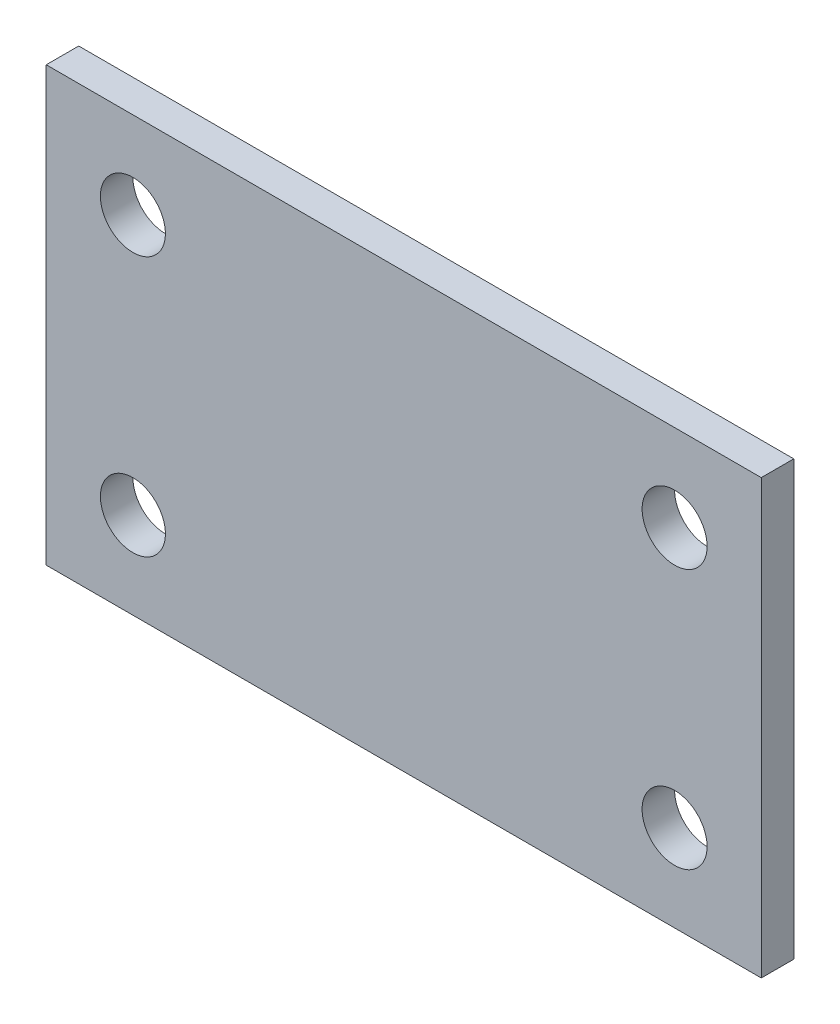
ISO-10303-21;
HEADER;
FILE_DESCRIPTION(('STEP AP214'),'2;1');
FILE_NAME('part.step','',(''),(''),'','','');
FILE_SCHEMA(('AUTOMOTIVE_DESIGN { 1 0 10303 214 1 1 1 1 }'));
ENDSEC;
DATA;
#1=APPLICATION_CONTEXT('core data for automotive mechanical design processes');
#2=APPLICATION_PROTOCOL_DEFINITION('international standard','automotive_design',2000,#1);
#3=PRODUCT_CONTEXT('',#1,'mechanical');
#4=PRODUCT('Part','Part','',(#3));
#5=PRODUCT_RELATED_PRODUCT_CATEGORY('part','',(#4));
#6=PRODUCT_DEFINITION_FORMATION('','',#4);
#7=PRODUCT_DEFINITION_CONTEXT('part definition',#1,'design');
#8=PRODUCT_DEFINITION('design','',#6,#7);
#9=PRODUCT_DEFINITION_SHAPE('','',#8);
#10=(LENGTH_UNIT() NAMED_UNIT(*) SI_UNIT(.MILLI.,.METRE.));
#11=(NAMED_UNIT(*) PLANE_ANGLE_UNIT() SI_UNIT($,.RADIAN.));
#12=(NAMED_UNIT(*) SI_UNIT($,.STERADIAN.) SOLID_ANGLE_UNIT());
#13=UNCERTAINTY_MEASURE_WITH_UNIT(LENGTH_MEASURE(1.E-05),#10,'distance_accuracy_value','');
#14=(GEOMETRIC_REPRESENTATION_CONTEXT(3) GLOBAL_UNCERTAINTY_ASSIGNED_CONTEXT((#13)) GLOBAL_UNIT_ASSIGNED_CONTEXT((#10,
#11,#12)) REPRESENTATION_CONTEXT('',''));
#15=CARTESIAN_POINT('',(0.,0.,0.));
#16=DIRECTION('',(0.,0.,1.));
#17=DIRECTION('',(1.,0.,0.));
#18=AXIS2_PLACEMENT_3D('',#15,#16,#17);
#19=CARTESIAN_POINT('',(0.,0.,3.));
#20=DIRECTION('',(0.,0.,1.));
#21=DIRECTION('',(1.,0.,0.));
#22=AXIS2_PLACEMENT_3D('',#19,#20,#21);
#23=PLANE('',#22);
#24=CARTESIAN_POINT('',(-25.,-12.,3.));
#25=DIRECTION('',(0.,0.,1.));
#26=DIRECTION('',(-1.,0.,0.));
#27=AXIS2_PLACEMENT_3D('',#24,#25,#26);
#28=CIRCLE('',#27,3.);
#29=CARTESIAN_POINT('',(-28.,-12.,3.));
#30=VERTEX_POINT('',#29);
#31=EDGE_CURVE('E123',#30,#30,#28,.T.);
#32=ORIENTED_EDGE('',*,*,#31,.F.);
#33=EDGE_LOOP('',(#32));
#34=FACE_BOUND('',#33,.T.);
#35=CARTESIAN_POINT('',(25.,12.,3.));
#36=DIRECTION('',(0.,0.,1.));
#37=DIRECTION('',(1.,0.,0.));
#38=AXIS2_PLACEMENT_3D('',#35,#36,#37);
#39=CIRCLE('',#38,3.);
#40=CARTESIAN_POINT('',(28.,12.,3.));
#41=VERTEX_POINT('',#40);
#42=EDGE_CURVE('E102',#41,#41,#39,.T.);
#43=ORIENTED_EDGE('',*,*,#42,.F.);
#44=EDGE_LOOP('',(#43));
#45=FACE_BOUND('',#44,.T.);
#46=DIRECTION('',(0.,-1.,0.));
#47=VECTOR('',#46,1.);
#48=CARTESIAN_POINT('',(-33.,20.,3.));
#49=LINE('',#48,#47);
#50=CARTESIAN_POINT('',(-33.,20.,3.));
#51=VERTEX_POINT('',#50);
#52=CARTESIAN_POINT('',(-33.,-20.,3.));
#53=VERTEX_POINT('',#52);
#54=EDGE_CURVE('E87',#51,#53,#49,.T.);
#55=ORIENTED_EDGE('',*,*,#54,.T.);
#56=DIRECTION('',(1.,0.,0.));
#57=VECTOR('',#56,1.);
#58=CARTESIAN_POINT('',(-33.,-20.,3.));
#59=LINE('',#58,#57);
#60=CARTESIAN_POINT('',(33.,-20.,3.));
#61=VERTEX_POINT('',#60);
#62=EDGE_CURVE('E82',#53,#61,#59,.T.);
#63=ORIENTED_EDGE('',*,*,#62,.T.);
#64=DIRECTION('',(0.,1.,0.));
#65=VECTOR('',#64,1.);
#66=CARTESIAN_POINT('',(33.,20.,3.));
#67=LINE('',#66,#65);
#68=CARTESIAN_POINT('',(33.,20.,3.));
#69=VERTEX_POINT('',#68);
#70=EDGE_CURVE('E85',#61,#69,#67,.T.);
#71=ORIENTED_EDGE('',*,*,#70,.T.);
#72=DIRECTION('',(-1.,0.,0.));
#73=VECTOR('',#72,1.);
#74=CARTESIAN_POINT('',(-33.,20.,3.));
#75=LINE('',#74,#73);
#76=EDGE_CURVE('E52',#69,#51,#75,.T.);
#77=ORIENTED_EDGE('',*,*,#76,.T.);
#78=EDGE_LOOP('',(#55,#63,#71,#77));
#79=FACE_BOUND('',#78,.T.);
#80=CARTESIAN_POINT('',(25.,-12.,3.));
#81=DIRECTION('',(0.,0.,1.));
#82=DIRECTION('',(1.,0.,0.));
#83=AXIS2_PLACEMENT_3D('',#80,#81,#82);
#84=CIRCLE('',#83,3.);
#85=CARTESIAN_POINT('',(28.,-12.,3.));
#86=VERTEX_POINT('',#85);
#87=EDGE_CURVE('E117',#86,#86,#84,.T.);
#88=ORIENTED_EDGE('',*,*,#87,.F.);
#89=EDGE_LOOP('',(#88));
#90=FACE_BOUND('',#89,.T.);
#91=CARTESIAN_POINT('',(-25.,12.,3.));
#92=DIRECTION('',(0.,0.,1.));
#93=DIRECTION('',(-1.,0.,0.));
#94=AXIS2_PLACEMENT_3D('',#91,#92,#93);
#95=CIRCLE('',#94,3.);
#96=CARTESIAN_POINT('',(-28.,12.,3.));
#97=VERTEX_POINT('',#96);
#98=EDGE_CURVE('E129',#97,#97,#95,.T.);
#99=ORIENTED_EDGE('',*,*,#98,.F.);
#100=EDGE_LOOP('',(#99));
#101=FACE_BOUND('',#100,.T.);
#102=ADVANCED_FACE('F35',(#34,#45,#79,#90,#101),#23,.T.);
#103=CARTESIAN_POINT('',(0.,0.,0.));
#104=DIRECTION('',(0.,0.,1.));
#105=DIRECTION('',(1.,0.,0.));
#106=AXIS2_PLACEMENT_3D('',#103,#104,#105);
#107=PLANE('',#106);
#108=DIRECTION('',(0.,-1.,0.));
#109=VECTOR('',#108,1.);
#110=CARTESIAN_POINT('',(-33.,20.,0.));
#111=LINE('',#110,#109);
#112=CARTESIAN_POINT('',(-33.,20.,0.));
#113=VERTEX_POINT('',#112);
#114=CARTESIAN_POINT('',(-33.,-20.,0.));
#115=VERTEX_POINT('',#114);
#116=EDGE_CURVE('E99',#113,#115,#111,.T.);
#117=ORIENTED_EDGE('',*,*,#116,.F.);
#118=DIRECTION('',(-1.,0.,0.));
#119=VECTOR('',#118,1.);
#120=CARTESIAN_POINT('',(-33.,20.,0.));
#121=LINE('',#120,#119);
#122=CARTESIAN_POINT('',(33.,20.,0.));
#123=VERTEX_POINT('',#122);
#124=EDGE_CURVE('E75',#123,#113,#121,.T.);
#125=ORIENTED_EDGE('',*,*,#124,.F.);
#126=DIRECTION('',(0.,1.,0.));
#127=VECTOR('',#126,1.);
#128=CARTESIAN_POINT('',(33.,20.,0.));
#129=LINE('',#128,#127);
#130=CARTESIAN_POINT('',(33.,-20.,0.));
#131=VERTEX_POINT('',#130);
#132=EDGE_CURVE('E69',#131,#123,#129,.T.);
#133=ORIENTED_EDGE('',*,*,#132,.F.);
#134=DIRECTION('',(1.,0.,0.));
#135=VECTOR('',#134,1.);
#136=CARTESIAN_POINT('',(-33.,-20.,0.));
#137=LINE('',#136,#135);
#138=EDGE_CURVE('E91',#115,#131,#137,.T.);
#139=ORIENTED_EDGE('',*,*,#138,.F.);
#140=EDGE_LOOP('',(#117,#125,#133,#139));
#141=FACE_BOUND('',#140,.T.);
#142=CARTESIAN_POINT('',(25.,12.,0.));
#143=DIRECTION('',(0.,0.,1.));
#144=DIRECTION('',(1.,0.,0.));
#145=AXIS2_PLACEMENT_3D('',#142,#143,#144);
#146=CIRCLE('',#145,3.);
#147=CARTESIAN_POINT('',(28.,12.,0.));
#148=VERTEX_POINT('',#147);
#149=EDGE_CURVE('E114',#148,#148,#146,.T.);
#150=ORIENTED_EDGE('',*,*,#149,.T.);
#151=EDGE_LOOP('',(#150));
#152=FACE_BOUND('',#151,.T.);
#153=CARTESIAN_POINT('',(25.,-12.,0.));
#154=DIRECTION('',(0.,0.,1.));
#155=DIRECTION('',(1.,0.,0.));
#156=AXIS2_PLACEMENT_3D('',#153,#154,#155);
#157=CIRCLE('',#156,3.);
#158=CARTESIAN_POINT('',(28.,-12.,0.));
#159=VERTEX_POINT('',#158);
#160=EDGE_CURVE('E120',#159,#159,#157,.T.);
#161=ORIENTED_EDGE('',*,*,#160,.T.);
#162=EDGE_LOOP('',(#161));
#163=FACE_BOUND('',#162,.T.);
#164=CARTESIAN_POINT('',(-25.,-12.,0.));
#165=DIRECTION('',(0.,0.,1.));
#166=DIRECTION('',(-1.,0.,0.));
#167=AXIS2_PLACEMENT_3D('',#164,#165,#166);
#168=CIRCLE('',#167,3.);
#169=CARTESIAN_POINT('',(-28.,-12.,0.));
#170=VERTEX_POINT('',#169);
#171=EDGE_CURVE('E126',#170,#170,#168,.T.);
#172=ORIENTED_EDGE('',*,*,#171,.T.);
#173=EDGE_LOOP('',(#172));
#174=FACE_BOUND('',#173,.T.);
#175=CARTESIAN_POINT('',(-25.,12.,0.));
#176=DIRECTION('',(0.,0.,1.));
#177=DIRECTION('',(-1.,0.,0.));
#178=AXIS2_PLACEMENT_3D('',#175,#176,#177);
#179=CIRCLE('',#178,3.);
#180=CARTESIAN_POINT('',(-28.,12.,0.));
#181=VERTEX_POINT('',#180);
#182=EDGE_CURVE('E132',#181,#181,#179,.T.);
#183=ORIENTED_EDGE('',*,*,#182,.T.);
#184=EDGE_LOOP('',(#183));
#185=FACE_BOUND('',#184,.T.);
#186=ADVANCED_FACE('F110',(#141,#152,#163,#174,#185),#107,.F.);
#187=CARTESIAN_POINT('',(-33.,20.,3.));
#188=DIRECTION('',(1.,0.,0.));
#189=DIRECTION('',(0.,1.,0.));
#190=AXIS2_PLACEMENT_3D('',#187,#188,#189);
#191=PLANE('',#190);
#192=ORIENTED_EDGE('',*,*,#116,.T.);
#193=DIRECTION('',(0.,0.,-1.));
#194=VECTOR('',#193,1.);
#195=CARTESIAN_POINT('',(-33.,-20.,3.));
#196=LINE('',#195,#194);
#197=EDGE_CURVE('E11',#53,#115,#196,.T.);
#198=ORIENTED_EDGE('',*,*,#197,.F.);
#199=ORIENTED_EDGE('',*,*,#54,.F.);
#200=DIRECTION('',(0.,0.,-1.));
#201=VECTOR('',#200,1.);
#202=CARTESIAN_POINT('',(-33.,20.,3.));
#203=LINE('',#202,#201);
#204=EDGE_CURVE('E95',#51,#113,#203,.T.);
#205=ORIENTED_EDGE('',*,*,#204,.T.);
#206=EDGE_LOOP('',(#192,#198,#199,#205));
#207=FACE_BOUND('',#206,.T.);
#208=ADVANCED_FACE('F37',(#207),#191,.F.);
#209=CARTESIAN_POINT('',(-33.,-20.,3.));
#210=DIRECTION('',(0.,1.,0.));
#211=DIRECTION('',(0.,0.,1.));
#212=AXIS2_PLACEMENT_3D('',#209,#210,#211);
#213=PLANE('',#212);
#214=ORIENTED_EDGE('',*,*,#138,.T.);
#215=DIRECTION('',(0.,0.,-1.));
#216=VECTOR('',#215,1.);
#217=CARTESIAN_POINT('',(33.,-20.,3.));
#218=LINE('',#217,#216);
#219=EDGE_CURVE('E44',#61,#131,#218,.T.);
#220=ORIENTED_EDGE('',*,*,#219,.F.);
#221=ORIENTED_EDGE('',*,*,#62,.F.);
#222=ORIENTED_EDGE('',*,*,#197,.T.);
#223=EDGE_LOOP('',(#214,#220,#221,#222));
#224=FACE_BOUND('',#223,.T.);
#225=ADVANCED_FACE('F90',(#224),#213,.F.);
#226=CARTESIAN_POINT('',(33.,20.,3.));
#227=DIRECTION('',(-1.,0.,0.));
#228=DIRECTION('',(0.,-1.,0.));
#229=AXIS2_PLACEMENT_3D('',#226,#227,#228);
#230=PLANE('',#229);
#231=ORIENTED_EDGE('',*,*,#132,.T.);
#232=DIRECTION('',(0.,0.,-1.));
#233=VECTOR('',#232,1.);
#234=CARTESIAN_POINT('',(33.,20.,3.));
#235=LINE('',#234,#233);
#236=EDGE_CURVE('E92',#69,#123,#235,.T.);
#237=ORIENTED_EDGE('',*,*,#236,.F.);
#238=ORIENTED_EDGE('',*,*,#70,.F.);
#239=ORIENTED_EDGE('',*,*,#219,.T.);
#240=EDGE_LOOP('',(#231,#237,#238,#239));
#241=FACE_BOUND('',#240,.T.);
#242=ADVANCED_FACE('F93',(#241),#230,.F.);
#243=CARTESIAN_POINT('',(-33.,20.,3.));
#244=DIRECTION('',(0.,-1.,0.));
#245=DIRECTION('',(0.,0.,-1.));
#246=AXIS2_PLACEMENT_3D('',#243,#244,#245);
#247=PLANE('',#246);
#248=ORIENTED_EDGE('',*,*,#124,.T.);
#249=ORIENTED_EDGE('',*,*,#204,.F.);
#250=ORIENTED_EDGE('',*,*,#76,.F.);
#251=ORIENTED_EDGE('',*,*,#236,.T.);
#252=EDGE_LOOP('',(#248,#249,#250,#251));
#253=FACE_BOUND('',#252,.T.);
#254=ADVANCED_FACE('F107',(#253),#247,.F.);
#255=CARTESIAN_POINT('',(25.,12.,3.));
#256=DIRECTION('',(0.,0.,-1.));
#257=DIRECTION('',(-1.,0.,0.));
#258=AXIS2_PLACEMENT_3D('',#255,#256,#257);
#259=CYLINDRICAL_SURFACE('',#258,3.);
#260=ORIENTED_EDGE('',*,*,#42,.T.);
#261=EDGE_LOOP('',(#260));
#262=FACE_BOUND('',#261,.T.);
#263=ORIENTED_EDGE('',*,*,#149,.F.);
#264=EDGE_LOOP('',(#263));
#265=FACE_BOUND('',#264,.T.);
#266=ADVANCED_FACE('F151',(#262,#265),#259,.F.);
#267=CARTESIAN_POINT('',(25.,-12.,3.));
#268=DIRECTION('',(0.,0.,-1.));
#269=DIRECTION('',(-1.,0.,0.));
#270=AXIS2_PLACEMENT_3D('',#267,#268,#269);
#271=CYLINDRICAL_SURFACE('',#270,3.);
#272=ORIENTED_EDGE('',*,*,#87,.T.);
#273=EDGE_LOOP('',(#272));
#274=FACE_BOUND('',#273,.T.);
#275=ORIENTED_EDGE('',*,*,#160,.F.);
#276=EDGE_LOOP('',(#275));
#277=FACE_BOUND('',#276,.T.);
#278=ADVANCED_FACE('F197',(#274,#277),#271,.F.);
#279=CARTESIAN_POINT('',(-25.,-12.,3.));
#280=DIRECTION('',(0.,0.,-1.));
#281=DIRECTION('',(-1.,0.,0.));
#282=AXIS2_PLACEMENT_3D('',#279,#280,#281);
#283=CYLINDRICAL_SURFACE('',#282,3.);
#284=ORIENTED_EDGE('',*,*,#31,.T.);
#285=EDGE_LOOP('',(#284));
#286=FACE_BOUND('',#285,.T.);
#287=ORIENTED_EDGE('',*,*,#171,.F.);
#288=EDGE_LOOP('',(#287));
#289=FACE_BOUND('',#288,.T.);
#290=ADVANCED_FACE('F205',(#286,#289),#283,.F.);
#291=CARTESIAN_POINT('',(-25.,12.,3.));
#292=DIRECTION('',(0.,0.,-1.));
#293=DIRECTION('',(-1.,0.,0.));
#294=AXIS2_PLACEMENT_3D('',#291,#292,#293);
#295=CYLINDRICAL_SURFACE('',#294,3.);
#296=ORIENTED_EDGE('',*,*,#98,.T.);
#297=EDGE_LOOP('',(#296));
#298=FACE_BOUND('',#297,.T.);
#299=ORIENTED_EDGE('',*,*,#182,.F.);
#300=EDGE_LOOP('',(#299));
#301=FACE_BOUND('',#300,.T.);
#302=ADVANCED_FACE('F138',(#298,#301),#295,.F.);
#303=CLOSED_SHELL('',(#102,#186,#208,#225,#242,#254,#266,#278,#290,#302));
#304=MANIFOLD_SOLID_BREP('B2',#303);
#305=ADVANCED_BREP_SHAPE_REPRESENTATION('',(#18,#304),#14);
#306=SHAPE_DEFINITION_REPRESENTATION(#9,#305);
ENDSEC;
END-ISO-10303-21;
